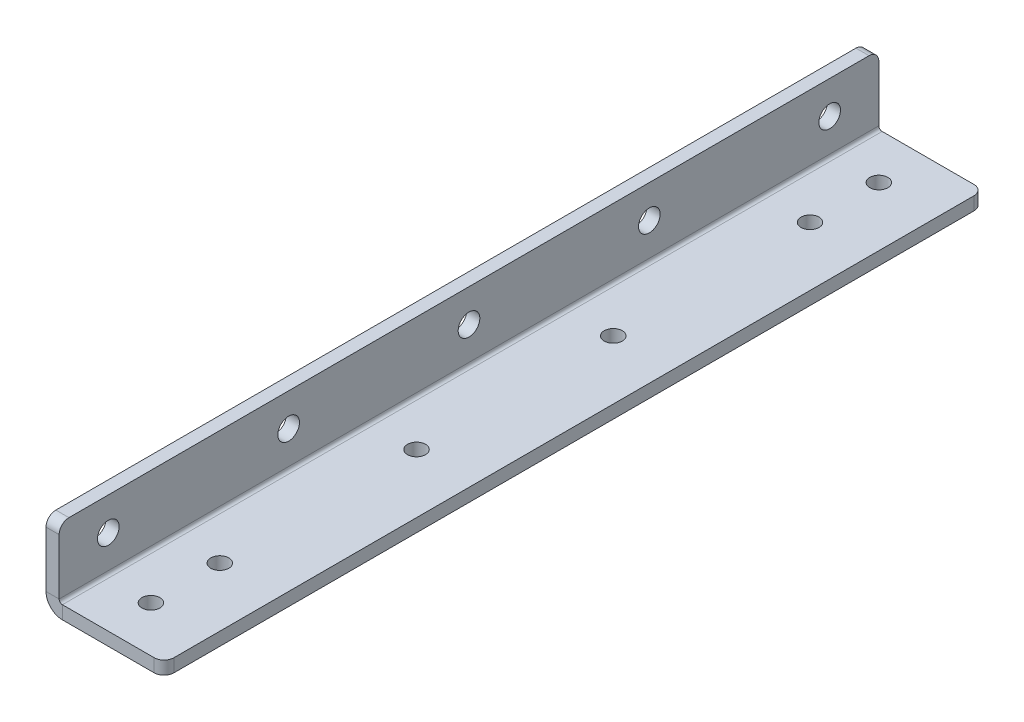
ISO-10303-21;
HEADER;
FILE_DESCRIPTION(('STEP AP214'),'2;1');
FILE_NAME('part.step','',(''),(''),'','','');
FILE_SCHEMA(('AUTOMOTIVE_DESIGN { 1 0 10303 214 1 1 1 1 }'));
ENDSEC;
DATA;
#1=APPLICATION_CONTEXT('core data for automotive mechanical design processes');
#2=APPLICATION_PROTOCOL_DEFINITION('international standard','automotive_design',2000,#1);
#3=PRODUCT_CONTEXT('',#1,'mechanical');
#4=PRODUCT('Part','Part','',(#3));
#5=PRODUCT_RELATED_PRODUCT_CATEGORY('part','',(#4));
#6=PRODUCT_DEFINITION_FORMATION('','',#4);
#7=PRODUCT_DEFINITION_CONTEXT('part definition',#1,'design');
#8=PRODUCT_DEFINITION('design','',#6,#7);
#9=PRODUCT_DEFINITION_SHAPE('','',#8);
#10=(LENGTH_UNIT() NAMED_UNIT(*) SI_UNIT(.MILLI.,.METRE.));
#11=(NAMED_UNIT(*) PLANE_ANGLE_UNIT() SI_UNIT($,.RADIAN.));
#12=(NAMED_UNIT(*) SI_UNIT($,.STERADIAN.) SOLID_ANGLE_UNIT());
#13=UNCERTAINTY_MEASURE_WITH_UNIT(LENGTH_MEASURE(1.E-05),#10,'distance_accuracy_value','');
#14=(GEOMETRIC_REPRESENTATION_CONTEXT(3) GLOBAL_UNCERTAINTY_ASSIGNED_CONTEXT((#13)) GLOBAL_UNIT_ASSIGNED_CONTEXT((#10,
#11,#12)) REPRESENTATION_CONTEXT('',''));
#15=CARTESIAN_POINT('',(0.,0.,0.));
#16=DIRECTION('',(0.,0.,1.));
#17=DIRECTION('',(1.,0.,0.));
#18=AXIS2_PLACEMENT_3D('',#15,#16,#17);
#19=CARTESIAN_POINT('',(0.,5.,125.));
#20=DIRECTION('',(0.,0.,1.));
#21=DIRECTION('',(1.,0.,0.));
#22=AXIS2_PLACEMENT_3D('',#19,#20,#21);
#23=PLANE('',#22);
#24=DIRECTION('',(1.,0.,0.));
#25=VECTOR('',#24,1.);
#26=CARTESIAN_POINT('',(0.,5.,125.));
#27=LINE('',#26,#25);
#28=CARTESIAN_POINT('',(0.,5.,125.));
#29=VERTEX_POINT('',#28);
#30=CARTESIAN_POINT('',(4.,5.,125.));
#31=VERTEX_POINT('',#30);
#32=EDGE_CURVE('E136',#29,#31,#27,.T.);
#33=ORIENTED_EDGE('',*,*,#32,.F.);
#34=CARTESIAN_POINT('',(5.,5.,125.));
#35=DIRECTION('',(0.,0.,-1.));
#36=DIRECTION('',(-1.,0.,0.));
#37=AXIS2_PLACEMENT_3D('',#34,#35,#36);
#38=CIRCLE('',#37,5.);
#39=CARTESIAN_POINT('',(5.,0.,125.));
#40=VERTEX_POINT('',#39);
#41=EDGE_CURVE('E134',#29,#40,#38,.F.);
#42=ORIENTED_EDGE('',*,*,#41,.T.);
#43=DIRECTION('',(0.,-1.,0.));
#44=VECTOR('',#43,1.);
#45=CARTESIAN_POINT('',(5.,4.,125.));
#46=LINE('',#45,#44);
#47=CARTESIAN_POINT('',(5.,4.,125.));
#48=VERTEX_POINT('',#47);
#49=EDGE_CURVE('E128',#48,#40,#46,.T.);
#50=ORIENTED_EDGE('',*,*,#49,.F.);
#51=CARTESIAN_POINT('',(5.,5.,125.));
#52=DIRECTION('',(0.,0.,1.));
#53=DIRECTION('',(1.,0.,0.));
#54=AXIS2_PLACEMENT_3D('',#51,#52,#53);
#55=CIRCLE('',#54,1.);
#56=EDGE_CURVE('E132',#31,#48,#55,.T.);
#57=ORIENTED_EDGE('',*,*,#56,.F.);
#58=EDGE_LOOP('',(#33,#42,#50,#57));
#59=FACE_BOUND('',#58,.T.);
#60=ADVANCED_FACE('F37',(#59),#23,.T.);
#61=CARTESIAN_POINT('',(5.,4.,125.));
#62=DIRECTION('',(0.,0.,1.));
#63=DIRECTION('',(1.,0.,0.));
#64=AXIS2_PLACEMENT_3D('',#61,#62,#63);
#65=PLANE('',#64);
#66=DIRECTION('',(0.,1.,0.));
#67=VECTOR('',#66,1.);
#68=CARTESIAN_POINT('',(4.,0.,125.));
#69=LINE('',#68,#67);
#70=CARTESIAN_POINT('',(4.,22.,125.));
#71=VERTEX_POINT('',#70);
#72=EDGE_CURVE('E160',#71,#31,#69,.F.);
#73=ORIENTED_EDGE('',*,*,#72,.F.);
#74=DIRECTION('',(1.,0.,0.));
#75=VECTOR('',#74,1.);
#76=CARTESIAN_POINT('',(5.,22.,125.));
#77=LINE('',#76,#75);
#78=CARTESIAN_POINT('',(0.,22.,125.));
#79=VERTEX_POINT('',#78);
#80=EDGE_CURVE('E11',#71,#79,#77,.F.);
#81=ORIENTED_EDGE('',*,*,#80,.T.);
#82=DIRECTION('',(0.,-1.,0.));
#83=VECTOR('',#82,1.);
#84=CARTESIAN_POINT('',(0.,0.,125.));
#85=LINE('',#84,#83);
#86=EDGE_CURVE('E162',#79,#29,#85,.T.);
#87=ORIENTED_EDGE('',*,*,#86,.T.);
#88=ORIENTED_EDGE('',*,*,#32,.T.);
#89=EDGE_LOOP('',(#73,#81,#87,#88));
#90=FACE_BOUND('',#89,.T.);
#91=ADVANCED_FACE('F359',(#90),#65,.T.);
#92=CARTESIAN_POINT('',(5.,0.,-125.));
#93=DIRECTION('',(0.,0.,-1.));
#94=DIRECTION('',(-1.,0.,0.));
#95=AXIS2_PLACEMENT_3D('',#92,#93,#94);
#96=PLANE('',#95);
#97=DIRECTION('',(0.,1.,0.));
#98=VECTOR('',#97,1.);
#99=CARTESIAN_POINT('',(5.,0.,-125.));
#100=LINE('',#99,#98);
#101=CARTESIAN_POINT('',(5.,0.,-125.));
#102=VERTEX_POINT('',#101);
#103=CARTESIAN_POINT('',(5.,4.,-125.));
#104=VERTEX_POINT('',#103);
#105=EDGE_CURVE('E137',#102,#104,#100,.T.);
#106=ORIENTED_EDGE('',*,*,#105,.F.);
#107=CARTESIAN_POINT('',(5.,5.,-125.));
#108=DIRECTION('',(0.,0.,-1.));
#109=DIRECTION('',(-1.,0.,0.));
#110=AXIS2_PLACEMENT_3D('',#107,#108,#109);
#111=CIRCLE('',#110,5.);
#112=CARTESIAN_POINT('',(0.,5.,-125.));
#113=VERTEX_POINT('',#112);
#114=EDGE_CURVE('E180',#113,#102,#111,.F.);
#115=ORIENTED_EDGE('',*,*,#114,.F.);
#116=DIRECTION('',(-1.,0.,0.));
#117=VECTOR('',#116,1.);
#118=CARTESIAN_POINT('',(4.,5.,-125.));
#119=LINE('',#118,#117);
#120=CARTESIAN_POINT('',(4.,5.,-125.));
#121=VERTEX_POINT('',#120);
#122=EDGE_CURVE('E198',#121,#113,#119,.T.);
#123=ORIENTED_EDGE('',*,*,#122,.F.);
#124=CARTESIAN_POINT('',(5.,5.,-125.));
#125=DIRECTION('',(0.,0.,1.));
#126=DIRECTION('',(1.,0.,0.));
#127=AXIS2_PLACEMENT_3D('',#124,#125,#126);
#128=CIRCLE('',#127,1.);
#129=EDGE_CURVE('E174',#121,#104,#128,.T.);
#130=ORIENTED_EDGE('',*,*,#129,.T.);
#131=EDGE_LOOP('',(#106,#115,#123,#130));
#132=FACE_BOUND('',#131,.T.);
#133=ADVANCED_FACE('F340',(#132),#96,.T.);
#134=CARTESIAN_POINT('',(4.,5.,-125.));
#135=DIRECTION('',(0.,0.,-1.));
#136=DIRECTION('',(-1.,0.,0.));
#137=AXIS2_PLACEMENT_3D('',#134,#135,#136);
#138=PLANE('',#137);
#139=DIRECTION('',(1.,0.,0.));
#140=VECTOR('',#139,1.);
#141=CARTESIAN_POINT('',(0.,4.,-125.));
#142=LINE('',#141,#140);
#143=CARTESIAN_POINT('',(33.,4.,-125.));
#144=VERTEX_POINT('',#143);
#145=EDGE_CURVE('E147',#104,#144,#142,.T.);
#146=ORIENTED_EDGE('',*,*,#145,.T.);
#147=DIRECTION('',(0.,-1.,0.));
#148=VECTOR('',#147,1.);
#149=CARTESIAN_POINT('',(33.,5.,-125.));
#150=LINE('',#149,#148);
#151=CARTESIAN_POINT('',(33.,0.,-125.));
#152=VERTEX_POINT('',#151);
#153=EDGE_CURVE('E220',#144,#152,#150,.T.);
#154=ORIENTED_EDGE('',*,*,#153,.T.);
#155=DIRECTION('',(1.,0.,0.));
#156=VECTOR('',#155,1.);
#157=CARTESIAN_POINT('',(0.,0.,-125.));
#158=LINE('',#157,#156);
#159=EDGE_CURVE('E169',#102,#152,#158,.T.);
#160=ORIENTED_EDGE('',*,*,#159,.F.);
#161=ORIENTED_EDGE('',*,*,#105,.T.);
#162=EDGE_LOOP('',(#146,#154,#160,#161));
#163=FACE_BOUND('',#162,.T.);
#164=ADVANCED_FACE('F238',(#163),#138,.T.);
#165=CARTESIAN_POINT('',(0.,0.,125.));
#166=DIRECTION('',(0.,1.,0.));
#167=DIRECTION('',(0.,0.,1.));
#168=AXIS2_PLACEMENT_3D('',#165,#166,#167);
#169=PLANE('',#168);
#170=CARTESIAN_POINT('',(18.,0.,111.));
#171=DIRECTION('',(0.,1.,0.));
#172=DIRECTION('',(0.,0.,1.));
#173=AXIS2_PLACEMENT_3D('',#170,#171,#172);
#174=CIRCLE('',#173,2.74999999999999);
#175=CARTESIAN_POINT('',(18.,0.,113.75));
#176=VERTEX_POINT('',#175);
#177=EDGE_CURVE('E279',#176,#176,#174,.T.);
#178=ORIENTED_EDGE('',*,*,#177,.T.);
#179=EDGE_LOOP('',(#178));
#180=FACE_BOUND('',#179,.T.);
#181=CARTESIAN_POINT('',(18.,0.,-111.));
#182=DIRECTION('',(0.,1.,0.));
#183=DIRECTION('',(0.,0.,1.));
#184=AXIS2_PLACEMENT_3D('',#181,#182,#183);
#185=CIRCLE('',#184,2.74999999999999);
#186=CARTESIAN_POINT('',(18.,0.,-108.25));
#187=VERTEX_POINT('',#186);
#188=EDGE_CURVE('E273',#187,#187,#185,.T.);
#189=ORIENTED_EDGE('',*,*,#188,.T.);
#190=EDGE_LOOP('',(#189));
#191=FACE_BOUND('',#190,.T.);
#192=CARTESIAN_POINT('',(18.,0.,-90.));
#193=DIRECTION('',(0.,1.,0.));
#194=DIRECTION('',(0.,0.,1.));
#195=AXIS2_PLACEMENT_3D('',#192,#193,#194);
#196=CIRCLE('',#195,2.75);
#197=CARTESIAN_POINT('',(18.,0.,-87.25));
#198=VERTEX_POINT('',#197);
#199=EDGE_CURVE('E267',#198,#198,#196,.T.);
#200=ORIENTED_EDGE('',*,*,#199,.T.);
#201=EDGE_LOOP('',(#200));
#202=FACE_BOUND('',#201,.T.);
#203=CARTESIAN_POINT('',(18.0000000000006,0.,-30.));
#204=DIRECTION('',(0.,1.,0.));
#205=DIRECTION('',(0.,0.,1.));
#206=AXIS2_PLACEMENT_3D('',#203,#204,#205);
#207=CIRCLE('',#206,2.75);
#208=CARTESIAN_POINT('',(18.0000000000006,0.,-27.25));
#209=VERTEX_POINT('',#208);
#210=EDGE_CURVE('E261',#209,#209,#207,.T.);
#211=ORIENTED_EDGE('',*,*,#210,.T.);
#212=EDGE_LOOP('',(#211));
#213=FACE_BOUND('',#212,.T.);
#214=CARTESIAN_POINT('',(18.0000000000012,0.,30.));
#215=DIRECTION('',(0.,1.,0.));
#216=DIRECTION('',(0.,0.,1.));
#217=AXIS2_PLACEMENT_3D('',#214,#215,#216);
#218=CIRCLE('',#217,2.75);
#219=CARTESIAN_POINT('',(18.0000000000012,0.,32.75));
#220=VERTEX_POINT('',#219);
#221=EDGE_CURVE('E255',#220,#220,#218,.T.);
#222=ORIENTED_EDGE('',*,*,#221,.T.);
#223=EDGE_LOOP('',(#222));
#224=FACE_BOUND('',#223,.T.);
#225=CARTESIAN_POINT('',(18.0000000000019,0.,90.));
#226=DIRECTION('',(0.,1.,0.));
#227=DIRECTION('',(0.,0.,1.));
#228=AXIS2_PLACEMENT_3D('',#225,#226,#227);
#229=CIRCLE('',#228,2.75);
#230=CARTESIAN_POINT('',(18.0000000000019,0.,92.75));
#231=VERTEX_POINT('',#230);
#232=EDGE_CURVE('E172',#231,#231,#229,.T.);
#233=ORIENTED_EDGE('',*,*,#232,.T.);
#234=EDGE_LOOP('',(#233));
#235=FACE_BOUND('',#234,.T.);
#236=ORIENTED_EDGE('',*,*,#159,.T.);
#237=CARTESIAN_POINT('',(33.,0.,-122.));
#238=DIRECTION('',(0.,1.,0.));
#239=DIRECTION('',(0.,0.,1.));
#240=AXIS2_PLACEMENT_3D('',#237,#238,#239);
#241=CIRCLE('',#240,3.);
#242=CARTESIAN_POINT('',(36.,0.,-122.));
#243=VERTEX_POINT('',#242);
#244=EDGE_CURVE('E225',#152,#243,#241,.F.);
#245=ORIENTED_EDGE('',*,*,#244,.T.);
#246=DIRECTION('',(0.,0.,-1.));
#247=VECTOR('',#246,1.);
#248=CARTESIAN_POINT('',(36.,0.,125.));
#249=LINE('',#248,#247);
#250=CARTESIAN_POINT('',(36.,0.,122.));
#251=VERTEX_POINT('',#250);
#252=EDGE_CURVE('E196',#251,#243,#249,.T.);
#253=ORIENTED_EDGE('',*,*,#252,.F.);
#254=CARTESIAN_POINT('',(33.,0.,122.));
#255=DIRECTION('',(0.,1.,0.));
#256=DIRECTION('',(0.,0.,1.));
#257=AXIS2_PLACEMENT_3D('',#254,#255,#256);
#258=CIRCLE('',#257,3.);
#259=CARTESIAN_POINT('',(33.,0.,125.));
#260=VERTEX_POINT('',#259);
#261=EDGE_CURVE('E223',#251,#260,#258,.F.);
#262=ORIENTED_EDGE('',*,*,#261,.T.);
#263=DIRECTION('',(1.,0.,0.));
#264=VECTOR('',#263,1.);
#265=CARTESIAN_POINT('',(0.,0.,125.));
#266=LINE('',#265,#264);
#267=EDGE_CURVE('E155',#40,#260,#266,.T.);
#268=ORIENTED_EDGE('',*,*,#267,.F.);
#269=DIRECTION('',(0.,0.,-1.));
#270=VECTOR('',#269,1.);
#271=CARTESIAN_POINT('',(5.,0.,125.));
#272=LINE('',#271,#270);
#273=EDGE_CURVE('E168',#40,#102,#272,.T.);
#274=ORIENTED_EDGE('',*,*,#273,.T.);
#275=EDGE_LOOP('',(#236,#245,#253,#262,#268,#274));
#276=FACE_BOUND('',#275,.T.);
#277=ADVANCED_FACE('F243',(#180,#191,#202,#213,#224,#235,#276),#169,.F.);
#278=CARTESIAN_POINT('',(36.,4.,125.));
#279=DIRECTION('',(1.,0.,0.));
#280=DIRECTION('',(0.,0.,-1.));
#281=AXIS2_PLACEMENT_3D('',#278,#279,#280);
#282=PLANE('',#281);
#283=ORIENTED_EDGE('',*,*,#252,.T.);
#284=DIRECTION('',(0.,-1.,0.));
#285=VECTOR('',#284,1.);
#286=CARTESIAN_POINT('',(36.,4.,-122.));
#287=LINE('',#286,#285);
#288=CARTESIAN_POINT('',(36.,4.,-122.));
#289=VERTEX_POINT('',#288);
#290=EDGE_CURVE('E59',#243,#289,#287,.F.);
#291=ORIENTED_EDGE('',*,*,#290,.T.);
#292=DIRECTION('',(0.,0.,-1.));
#293=VECTOR('',#292,1.);
#294=CARTESIAN_POINT('',(36.,4.,125.));
#295=LINE('',#294,#293);
#296=CARTESIAN_POINT('',(36.,4.,122.));
#297=VERTEX_POINT('',#296);
#298=EDGE_CURVE('E151',#297,#289,#295,.T.);
#299=ORIENTED_EDGE('',*,*,#298,.F.);
#300=DIRECTION('',(0.,-1.,0.));
#301=VECTOR('',#300,1.);
#302=CARTESIAN_POINT('',(36.,4.,122.));
#303=LINE('',#302,#301);
#304=EDGE_CURVE('E227',#297,#251,#303,.T.);
#305=ORIENTED_EDGE('',*,*,#304,.T.);
#306=EDGE_LOOP('',(#283,#291,#299,#305));
#307=FACE_BOUND('',#306,.T.);
#308=ADVANCED_FACE('F244',(#307),#282,.T.);
#309=CARTESIAN_POINT('',(0.,4.,125.));
#310=DIRECTION('',(0.,1.,0.));
#311=DIRECTION('',(0.,0.,1.));
#312=AXIS2_PLACEMENT_3D('',#309,#310,#311);
#313=PLANE('',#312);
#314=CARTESIAN_POINT('',(18.,4.,111.));
#315=DIRECTION('',(0.,1.,0.));
#316=DIRECTION('',(0.,0.,1.));
#317=AXIS2_PLACEMENT_3D('',#314,#315,#316);
#318=CIRCLE('',#317,2.74999999999999);
#319=CARTESIAN_POINT('',(18.,4.,113.75));
#320=VERTEX_POINT('',#319);
#321=EDGE_CURVE('E282',#320,#320,#318,.T.);
#322=ORIENTED_EDGE('',*,*,#321,.F.);
#323=EDGE_LOOP('',(#322));
#324=FACE_BOUND('',#323,.T.);
#325=CARTESIAN_POINT('',(18.,4.,-111.));
#326=DIRECTION('',(0.,1.,0.));
#327=DIRECTION('',(0.,0.,1.));
#328=AXIS2_PLACEMENT_3D('',#325,#326,#327);
#329=CIRCLE('',#328,2.74999999999999);
#330=CARTESIAN_POINT('',(18.,4.,-108.25));
#331=VERTEX_POINT('',#330);
#332=EDGE_CURVE('E276',#331,#331,#329,.T.);
#333=ORIENTED_EDGE('',*,*,#332,.F.);
#334=EDGE_LOOP('',(#333));
#335=FACE_BOUND('',#334,.T.);
#336=CARTESIAN_POINT('',(18.,4.,-90.));
#337=DIRECTION('',(0.,1.,0.));
#338=DIRECTION('',(0.,0.,1.));
#339=AXIS2_PLACEMENT_3D('',#336,#337,#338);
#340=CIRCLE('',#339,2.75);
#341=CARTESIAN_POINT('',(18.,4.,-87.25));
#342=VERTEX_POINT('',#341);
#343=EDGE_CURVE('E270',#342,#342,#340,.T.);
#344=ORIENTED_EDGE('',*,*,#343,.F.);
#345=EDGE_LOOP('',(#344));
#346=FACE_BOUND('',#345,.T.);
#347=CARTESIAN_POINT('',(18.0000000000006,4.,-30.));
#348=DIRECTION('',(0.,1.,0.));
#349=DIRECTION('',(0.,0.,1.));
#350=AXIS2_PLACEMENT_3D('',#347,#348,#349);
#351=CIRCLE('',#350,2.75);
#352=CARTESIAN_POINT('',(18.0000000000006,4.,-27.25));
#353=VERTEX_POINT('',#352);
#354=EDGE_CURVE('E264',#353,#353,#351,.T.);
#355=ORIENTED_EDGE('',*,*,#354,.F.);
#356=EDGE_LOOP('',(#355));
#357=FACE_BOUND('',#356,.T.);
#358=CARTESIAN_POINT('',(18.0000000000012,4.,30.));
#359=DIRECTION('',(0.,1.,0.));
#360=DIRECTION('',(0.,0.,1.));
#361=AXIS2_PLACEMENT_3D('',#358,#359,#360);
#362=CIRCLE('',#361,2.75);
#363=CARTESIAN_POINT('',(18.0000000000012,4.,32.75));
#364=VERTEX_POINT('',#363);
#365=EDGE_CURVE('E258',#364,#364,#362,.T.);
#366=ORIENTED_EDGE('',*,*,#365,.F.);
#367=EDGE_LOOP('',(#366));
#368=FACE_BOUND('',#367,.T.);
#369=CARTESIAN_POINT('',(18.0000000000019,4.,90.));
#370=DIRECTION('',(0.,1.,0.));
#371=DIRECTION('',(0.,0.,1.));
#372=AXIS2_PLACEMENT_3D('',#369,#370,#371);
#373=CIRCLE('',#372,2.75);
#374=CARTESIAN_POINT('',(18.0000000000019,4.,92.75));
#375=VERTEX_POINT('',#374);
#376=EDGE_CURVE('E252',#375,#375,#373,.T.);
#377=ORIENTED_EDGE('',*,*,#376,.F.);
#378=EDGE_LOOP('',(#377));
#379=FACE_BOUND('',#378,.T.);
#380=ORIENTED_EDGE('',*,*,#298,.T.);
#381=CARTESIAN_POINT('',(33.,4.,-122.));
#382=DIRECTION('',(0.,1.,0.));
#383=DIRECTION('',(0.,0.,1.));
#384=AXIS2_PLACEMENT_3D('',#381,#382,#383);
#385=CIRCLE('',#384,3.);
#386=EDGE_CURVE('E233',#289,#144,#385,.T.);
#387=ORIENTED_EDGE('',*,*,#386,.T.);
#388=ORIENTED_EDGE('',*,*,#145,.F.);
#389=DIRECTION('',(0.,0.,-1.));
#390=VECTOR('',#389,1.);
#391=CARTESIAN_POINT('',(5.,4.,125.));
#392=LINE('',#391,#390);
#393=EDGE_CURVE('E142',#48,#104,#392,.T.);
#394=ORIENTED_EDGE('',*,*,#393,.F.);
#395=DIRECTION('',(1.,0.,0.));
#396=VECTOR('',#395,1.);
#397=CARTESIAN_POINT('',(0.,4.,125.));
#398=LINE('',#397,#396);
#399=CARTESIAN_POINT('',(33.,4.,125.));
#400=VERTEX_POINT('',#399);
#401=EDGE_CURVE('E144',#48,#400,#398,.T.);
#402=ORIENTED_EDGE('',*,*,#401,.T.);
#403=CARTESIAN_POINT('',(33.,4.,122.));
#404=DIRECTION('',(0.,1.,0.));
#405=DIRECTION('',(0.,0.,1.));
#406=AXIS2_PLACEMENT_3D('',#403,#404,#405);
#407=CIRCLE('',#406,3.);
#408=EDGE_CURVE('E231',#400,#297,#407,.T.);
#409=ORIENTED_EDGE('',*,*,#408,.T.);
#410=EDGE_LOOP('',(#380,#387,#388,#394,#402,#409));
#411=FACE_BOUND('',#410,.T.);
#412=ADVANCED_FACE('F143',(#324,#335,#346,#357,#368,#379,#411),#313,.T.);
#413=CARTESIAN_POINT('',(5.,5.,125.));
#414=DIRECTION('',(0.,0.,-1.));
#415=DIRECTION('',(-1.,0.,0.));
#416=AXIS2_PLACEMENT_3D('',#413,#414,#415);
#417=CYLINDRICAL_SURFACE('',#416,1.);
#418=ORIENTED_EDGE('',*,*,#129,.F.);
#419=DIRECTION('',(0.,0.,-1.));
#420=VECTOR('',#419,1.);
#421=CARTESIAN_POINT('',(4.,5.,125.));
#422=LINE('',#421,#420);
#423=EDGE_CURVE('E152',#31,#121,#422,.T.);
#424=ORIENTED_EDGE('',*,*,#423,.F.);
#425=ORIENTED_EDGE('',*,*,#56,.T.);
#426=ORIENTED_EDGE('',*,*,#393,.T.);
#427=EDGE_LOOP('',(#418,#424,#425,#426));
#428=FACE_BOUND('',#427,.T.);
#429=ADVANCED_FACE('F158',(#428),#417,.F.);
#430=CARTESIAN_POINT('',(4.,0.,125.));
#431=DIRECTION('',(1.,0.,0.));
#432=DIRECTION('',(0.,0.,-1.));
#433=AXIS2_PLACEMENT_3D('',#430,#431,#432);
#434=PLANE('',#433);
#435=CARTESIAN_POINT('',(4.,15.,110.));
#436=DIRECTION('',(1.,0.,0.));
#437=DIRECTION('',(0.,0.,-1.));
#438=AXIS2_PLACEMENT_3D('',#435,#436,#437);
#439=CIRCLE('',#438,3.29999999999999);
#440=CARTESIAN_POINT('',(4.,15.,106.7));
#441=VERTEX_POINT('',#440);
#442=EDGE_CURVE('E312',#441,#441,#439,.T.);
#443=ORIENTED_EDGE('',*,*,#442,.F.);
#444=EDGE_LOOP('',(#443));
#445=FACE_BOUND('',#444,.T.);
#446=CARTESIAN_POINT('',(4.,15.,55.));
#447=DIRECTION('',(1.,0.,0.));
#448=DIRECTION('',(0.,0.,-1.));
#449=AXIS2_PLACEMENT_3D('',#446,#447,#448);
#450=CIRCLE('',#449,3.29999999999999);
#451=CARTESIAN_POINT('',(4.,15.,51.7));
#452=VERTEX_POINT('',#451);
#453=EDGE_CURVE('E306',#452,#452,#450,.T.);
#454=ORIENTED_EDGE('',*,*,#453,.F.);
#455=EDGE_LOOP('',(#454));
#456=FACE_BOUND('',#455,.T.);
#457=CARTESIAN_POINT('',(4.,15.,0.));
#458=DIRECTION('',(1.,0.,0.));
#459=DIRECTION('',(0.,0.,-1.));
#460=AXIS2_PLACEMENT_3D('',#457,#458,#459);
#461=CIRCLE('',#460,3.29999999999999);
#462=CARTESIAN_POINT('',(4.,15.,-3.29999999999999));
#463=VERTEX_POINT('',#462);
#464=EDGE_CURVE('E300',#463,#463,#461,.T.);
#465=ORIENTED_EDGE('',*,*,#464,.F.);
#466=EDGE_LOOP('',(#465));
#467=FACE_BOUND('',#466,.T.);
#468=CARTESIAN_POINT('',(4.,15.,-55.));
#469=DIRECTION('',(1.,0.,0.));
#470=DIRECTION('',(0.,0.,-1.));
#471=AXIS2_PLACEMENT_3D('',#468,#469,#470);
#472=CIRCLE('',#471,3.29999999999999);
#473=CARTESIAN_POINT('',(4.,15.,-58.3));
#474=VERTEX_POINT('',#473);
#475=EDGE_CURVE('E294',#474,#474,#472,.T.);
#476=ORIENTED_EDGE('',*,*,#475,.F.);
#477=EDGE_LOOP('',(#476));
#478=FACE_BOUND('',#477,.T.);
#479=CARTESIAN_POINT('',(4.,15.,-110.));
#480=DIRECTION('',(1.,0.,0.));
#481=DIRECTION('',(0.,0.,-1.));
#482=AXIS2_PLACEMENT_3D('',#479,#480,#481);
#483=CIRCLE('',#482,3.29999999999999);
#484=CARTESIAN_POINT('',(4.,15.,-113.3));
#485=VERTEX_POINT('',#484);
#486=EDGE_CURVE('E288',#485,#485,#483,.T.);
#487=ORIENTED_EDGE('',*,*,#486,.F.);
#488=EDGE_LOOP('',(#487));
#489=FACE_BOUND('',#488,.T.);
#490=DIRECTION('',(0.,1.,0.));
#491=VECTOR('',#490,1.);
#492=CARTESIAN_POINT('',(4.,0.,-125.));
#493=LINE('',#492,#491);
#494=CARTESIAN_POINT('',(4.,22.,-125.));
#495=VERTEX_POINT('',#494);
#496=EDGE_CURVE('E176',#495,#121,#493,.F.);
#497=ORIENTED_EDGE('',*,*,#496,.F.);
#498=CARTESIAN_POINT('',(4.,22.,-122.));
#499=DIRECTION('',(1.,0.,0.));
#500=DIRECTION('',(0.,0.,-1.));
#501=AXIS2_PLACEMENT_3D('',#498,#499,#500);
#502=CIRCLE('',#501,3.);
#503=CARTESIAN_POINT('',(4.,25.,-122.));
#504=VERTEX_POINT('',#503);
#505=EDGE_CURVE('E209',#495,#504,#502,.T.);
#506=ORIENTED_EDGE('',*,*,#505,.T.);
#507=DIRECTION('',(0.,0.,-1.));
#508=VECTOR('',#507,1.);
#509=CARTESIAN_POINT('',(4.,25.,125.));
#510=LINE('',#509,#508);
#511=CARTESIAN_POINT('',(4.,25.,122.));
#512=VERTEX_POINT('',#511);
#513=EDGE_CURVE('E191',#512,#504,#510,.T.);
#514=ORIENTED_EDGE('',*,*,#513,.F.);
#515=CARTESIAN_POINT('',(4.,22.,122.));
#516=DIRECTION('',(1.,0.,0.));
#517=DIRECTION('',(0.,0.,-1.));
#518=AXIS2_PLACEMENT_3D('',#515,#516,#517);
#519=CIRCLE('',#518,3.);
#520=EDGE_CURVE('E207',#512,#71,#519,.T.);
#521=ORIENTED_EDGE('',*,*,#520,.T.);
#522=ORIENTED_EDGE('',*,*,#72,.T.);
#523=ORIENTED_EDGE('',*,*,#423,.T.);
#524=EDGE_LOOP('',(#497,#506,#514,#521,#522,#523));
#525=FACE_BOUND('',#524,.T.);
#526=ADVANCED_FACE('F318',(#445,#456,#467,#478,#489,#525),#434,.T.);
#527=CARTESIAN_POINT('',(0.,25.,125.));
#528=DIRECTION('',(0.,1.,0.));
#529=DIRECTION('',(0.,0.,1.));
#530=AXIS2_PLACEMENT_3D('',#527,#528,#529);
#531=PLANE('',#530);
#532=ORIENTED_EDGE('',*,*,#513,.T.);
#533=DIRECTION('',(1.,0.,0.));
#534=VECTOR('',#533,1.);
#535=CARTESIAN_POINT('',(0.,25.,-122.));
#536=LINE('',#535,#534);
#537=CARTESIAN_POINT('',(0.,25.,-122.));
#538=VERTEX_POINT('',#537);
#539=EDGE_CURVE('E214',#504,#538,#536,.F.);
#540=ORIENTED_EDGE('',*,*,#539,.T.);
#541=DIRECTION('',(0.,0.,-1.));
#542=VECTOR('',#541,1.);
#543=CARTESIAN_POINT('',(0.,25.,125.));
#544=LINE('',#543,#542);
#545=CARTESIAN_POINT('',(0.,25.,122.));
#546=VERTEX_POINT('',#545);
#547=EDGE_CURVE('E188',#546,#538,#544,.T.);
#548=ORIENTED_EDGE('',*,*,#547,.F.);
#549=DIRECTION('',(1.,0.,0.));
#550=VECTOR('',#549,1.);
#551=CARTESIAN_POINT('',(0.,25.,122.));
#552=LINE('',#551,#550);
#553=EDGE_CURVE('E211',#546,#512,#552,.T.);
#554=ORIENTED_EDGE('',*,*,#553,.T.);
#555=EDGE_LOOP('',(#532,#540,#548,#554));
#556=FACE_BOUND('',#555,.T.);
#557=ADVANCED_FACE('F321',(#556),#531,.T.);
#558=CARTESIAN_POINT('',(0.,0.,125.));
#559=DIRECTION('',(1.,0.,0.));
#560=DIRECTION('',(0.,0.,-1.));
#561=AXIS2_PLACEMENT_3D('',#558,#559,#560);
#562=PLANE('',#561);
#563=CARTESIAN_POINT('',(0.,15.,110.));
#564=DIRECTION('',(1.,0.,0.));
#565=DIRECTION('',(0.,0.,-1.));
#566=AXIS2_PLACEMENT_3D('',#563,#564,#565);
#567=CIRCLE('',#566,3.29999999999999);
#568=CARTESIAN_POINT('',(0.,15.,106.7));
#569=VERTEX_POINT('',#568);
#570=EDGE_CURVE('E309',#569,#569,#567,.T.);
#571=ORIENTED_EDGE('',*,*,#570,.T.);
#572=EDGE_LOOP('',(#571));
#573=FACE_BOUND('',#572,.T.);
#574=CARTESIAN_POINT('',(0.,15.,55.));
#575=DIRECTION('',(1.,0.,0.));
#576=DIRECTION('',(0.,0.,-1.));
#577=AXIS2_PLACEMENT_3D('',#574,#575,#576);
#578=CIRCLE('',#577,3.29999999999999);
#579=CARTESIAN_POINT('',(0.,15.,51.7));
#580=VERTEX_POINT('',#579);
#581=EDGE_CURVE('E303',#580,#580,#578,.T.);
#582=ORIENTED_EDGE('',*,*,#581,.T.);
#583=EDGE_LOOP('',(#582));
#584=FACE_BOUND('',#583,.T.);
#585=CARTESIAN_POINT('',(0.,15.,0.));
#586=DIRECTION('',(1.,0.,0.));
#587=DIRECTION('',(0.,0.,-1.));
#588=AXIS2_PLACEMENT_3D('',#585,#586,#587);
#589=CIRCLE('',#588,3.29999999999999);
#590=CARTESIAN_POINT('',(0.,15.,-3.29999999999999));
#591=VERTEX_POINT('',#590);
#592=EDGE_CURVE('E297',#591,#591,#589,.T.);
#593=ORIENTED_EDGE('',*,*,#592,.T.);
#594=EDGE_LOOP('',(#593));
#595=FACE_BOUND('',#594,.T.);
#596=CARTESIAN_POINT('',(0.,15.,-55.));
#597=DIRECTION('',(1.,0.,0.));
#598=DIRECTION('',(0.,0.,-1.));
#599=AXIS2_PLACEMENT_3D('',#596,#597,#598);
#600=CIRCLE('',#599,3.29999999999999);
#601=CARTESIAN_POINT('',(0.,15.,-58.3));
#602=VERTEX_POINT('',#601);
#603=EDGE_CURVE('E291',#602,#602,#600,.T.);
#604=ORIENTED_EDGE('',*,*,#603,.T.);
#605=EDGE_LOOP('',(#604));
#606=FACE_BOUND('',#605,.T.);
#607=CARTESIAN_POINT('',(0.,15.,-110.));
#608=DIRECTION('',(1.,0.,0.));
#609=DIRECTION('',(0.,0.,-1.));
#610=AXIS2_PLACEMENT_3D('',#607,#608,#609);
#611=CIRCLE('',#610,3.29999999999999);
#612=CARTESIAN_POINT('',(0.,15.,-113.3));
#613=VERTEX_POINT('',#612);
#614=EDGE_CURVE('E285',#613,#613,#611,.T.);
#615=ORIENTED_EDGE('',*,*,#614,.T.);
#616=EDGE_LOOP('',(#615));
#617=FACE_BOUND('',#616,.T.);
#618=ORIENTED_EDGE('',*,*,#547,.T.);
#619=CARTESIAN_POINT('',(0.,22.,-122.));
#620=DIRECTION('',(1.,0.,0.));
#621=DIRECTION('',(0.,0.,-1.));
#622=AXIS2_PLACEMENT_3D('',#619,#620,#621);
#623=CIRCLE('',#622,3.);
#624=CARTESIAN_POINT('',(0.,22.,-125.));
#625=VERTEX_POINT('',#624);
#626=EDGE_CURVE('E218',#538,#625,#623,.F.);
#627=ORIENTED_EDGE('',*,*,#626,.T.);
#628=DIRECTION('',(0.,-1.,0.));
#629=VECTOR('',#628,1.);
#630=CARTESIAN_POINT('',(0.,0.,-125.));
#631=LINE('',#630,#629);
#632=EDGE_CURVE('E178',#625,#113,#631,.T.);
#633=ORIENTED_EDGE('',*,*,#632,.T.);
#634=DIRECTION('',(0.,0.,-1.));
#635=VECTOR('',#634,1.);
#636=CARTESIAN_POINT('',(0.,5.,125.));
#637=LINE('',#636,#635);
#638=EDGE_CURVE('E185',#29,#113,#637,.T.);
#639=ORIENTED_EDGE('',*,*,#638,.F.);
#640=ORIENTED_EDGE('',*,*,#86,.F.);
#641=CARTESIAN_POINT('',(0.,22.,122.));
#642=DIRECTION('',(1.,0.,0.));
#643=DIRECTION('',(0.,0.,-1.));
#644=AXIS2_PLACEMENT_3D('',#641,#642,#643);
#645=CIRCLE('',#644,3.);
#646=EDGE_CURVE('E216',#79,#546,#645,.F.);
#647=ORIENTED_EDGE('',*,*,#646,.T.);
#648=EDGE_LOOP('',(#618,#627,#633,#639,#640,#647));
#649=FACE_BOUND('',#648,.T.);
#650=ADVANCED_FACE('F346',(#573,#584,#595,#606,#617,#649),#562,.F.);
#651=CARTESIAN_POINT('',(5.,5.,125.));
#652=DIRECTION('',(0.,0.,-1.));
#653=DIRECTION('',(-1.,0.,0.));
#654=AXIS2_PLACEMENT_3D('',#651,#652,#653);
#655=CYLINDRICAL_SURFACE('',#654,5.);
#656=ORIENTED_EDGE('',*,*,#114,.T.);
#657=ORIENTED_EDGE('',*,*,#273,.F.);
#658=ORIENTED_EDGE('',*,*,#41,.F.);
#659=ORIENTED_EDGE('',*,*,#638,.T.);
#660=EDGE_LOOP('',(#656,#657,#658,#659));
#661=FACE_BOUND('',#660,.T.);
#662=ADVANCED_FACE('F342',(#661),#655,.T.);
#663=CARTESIAN_POINT('',(5.,5.,125.));
#664=DIRECTION('',(0.,0.,1.));
#665=DIRECTION('',(1.,0.,0.));
#666=AXIS2_PLACEMENT_3D('',#663,#664,#665);
#667=PLANE('',#666);
#668=ORIENTED_EDGE('',*,*,#267,.T.);
#669=DIRECTION('',(0.,-1.,0.));
#670=VECTOR('',#669,1.);
#671=CARTESIAN_POINT('',(33.,5.,125.));
#672=LINE('',#671,#670);
#673=EDGE_CURVE('E45',#260,#400,#672,.F.);
#674=ORIENTED_EDGE('',*,*,#673,.T.);
#675=ORIENTED_EDGE('',*,*,#401,.F.);
#676=ORIENTED_EDGE('',*,*,#49,.T.);
#677=EDGE_LOOP('',(#668,#674,#675,#676));
#678=FACE_BOUND('',#677,.T.);
#679=ADVANCED_FACE('F154',(#678),#667,.T.);
#680=CARTESIAN_POINT('',(5.,5.,-125.));
#681=DIRECTION('',(0.,0.,1.));
#682=DIRECTION('',(1.,0.,0.));
#683=AXIS2_PLACEMENT_3D('',#680,#681,#682);
#684=PLANE('',#683);
#685=ORIENTED_EDGE('',*,*,#632,.F.);
#686=DIRECTION('',(1.,0.,0.));
#687=VECTOR('',#686,1.);
#688=CARTESIAN_POINT('',(4.,22.,-125.));
#689=LINE('',#688,#687);
#690=EDGE_CURVE('E204',#625,#495,#689,.T.);
#691=ORIENTED_EDGE('',*,*,#690,.T.);
#692=ORIENTED_EDGE('',*,*,#496,.T.);
#693=ORIENTED_EDGE('',*,*,#122,.T.);
#694=EDGE_LOOP('',(#685,#691,#692,#693));
#695=FACE_BOUND('',#694,.T.);
#696=ADVANCED_FACE('F336',(#695),#684,.F.);
#697=CARTESIAN_POINT('',(5.,22.,-122.));
#698=DIRECTION('',(-1.,0.,0.));
#699=DIRECTION('',(0.,0.,1.));
#700=AXIS2_PLACEMENT_3D('',#697,#698,#699);
#701=CYLINDRICAL_SURFACE('',#700,3.);
#702=ORIENTED_EDGE('',*,*,#626,.F.);
#703=ORIENTED_EDGE('',*,*,#539,.F.);
#704=ORIENTED_EDGE('',*,*,#505,.F.);
#705=ORIENTED_EDGE('',*,*,#690,.F.);
#706=EDGE_LOOP('',(#702,#703,#704,#705));
#707=FACE_BOUND('',#706,.T.);
#708=ADVANCED_FACE('F350',(#707),#701,.T.);
#709=CARTESIAN_POINT('',(33.,5.,-122.));
#710=DIRECTION('',(0.,-1.,0.));
#711=DIRECTION('',(0.,0.,-1.));
#712=AXIS2_PLACEMENT_3D('',#709,#710,#711);
#713=CYLINDRICAL_SURFACE('',#712,3.);
#714=ORIENTED_EDGE('',*,*,#386,.F.);
#715=ORIENTED_EDGE('',*,*,#290,.F.);
#716=ORIENTED_EDGE('',*,*,#244,.F.);
#717=ORIENTED_EDGE('',*,*,#153,.F.);
#718=EDGE_LOOP('',(#714,#715,#716,#717));
#719=FACE_BOUND('',#718,.T.);
#720=ADVANCED_FACE('F240',(#719),#713,.T.);
#721=CARTESIAN_POINT('',(33.,4.,122.));
#722=DIRECTION('',(0.,-1.,0.));
#723=DIRECTION('',(0.,0.,-1.));
#724=AXIS2_PLACEMENT_3D('',#721,#722,#723);
#725=CYLINDRICAL_SURFACE('',#724,3.);
#726=ORIENTED_EDGE('',*,*,#408,.F.);
#727=ORIENTED_EDGE('',*,*,#673,.F.);
#728=ORIENTED_EDGE('',*,*,#261,.F.);
#729=ORIENTED_EDGE('',*,*,#304,.F.);
#730=EDGE_LOOP('',(#726,#727,#728,#729));
#731=FACE_BOUND('',#730,.T.);
#732=ADVANCED_FACE('F247',(#731),#725,.T.);
#733=CARTESIAN_POINT('',(0.,22.,122.));
#734=DIRECTION('',(1.,0.,0.));
#735=DIRECTION('',(0.,0.,-1.));
#736=AXIS2_PLACEMENT_3D('',#733,#734,#735);
#737=CYLINDRICAL_SURFACE('',#736,3.);
#738=ORIENTED_EDGE('',*,*,#646,.F.);
#739=ORIENTED_EDGE('',*,*,#80,.F.);
#740=ORIENTED_EDGE('',*,*,#520,.F.);
#741=ORIENTED_EDGE('',*,*,#553,.F.);
#742=EDGE_LOOP('',(#738,#739,#740,#741));
#743=FACE_BOUND('',#742,.T.);
#744=ADVANCED_FACE('F39',(#743),#737,.T.);
#745=CARTESIAN_POINT('',(18.0000000000019,4.,90.));
#746=DIRECTION('',(0.,1.,0.));
#747=DIRECTION('',(0.,0.,1.));
#748=AXIS2_PLACEMENT_3D('',#745,#746,#747);
#749=CYLINDRICAL_SURFACE('',#748,2.75);
#750=ORIENTED_EDGE('',*,*,#232,.F.);
#751=EDGE_LOOP('',(#750));
#752=FACE_BOUND('',#751,.T.);
#753=ORIENTED_EDGE('',*,*,#376,.T.);
#754=EDGE_LOOP('',(#753));
#755=FACE_BOUND('',#754,.T.);
#756=ADVANCED_FACE('F377',(#752,#755),#749,.F.);
#757=CARTESIAN_POINT('',(18.0000000000012,4.,30.));
#758=DIRECTION('',(0.,1.,0.));
#759=DIRECTION('',(0.,0.,1.));
#760=AXIS2_PLACEMENT_3D('',#757,#758,#759);
#761=CYLINDRICAL_SURFACE('',#760,2.75);
#762=ORIENTED_EDGE('',*,*,#221,.F.);
#763=EDGE_LOOP('',(#762));
#764=FACE_BOUND('',#763,.T.);
#765=ORIENTED_EDGE('',*,*,#365,.T.);
#766=EDGE_LOOP('',(#765));
#767=FACE_BOUND('',#766,.T.);
#768=ADVANCED_FACE('F381',(#764,#767),#761,.F.);
#769=CARTESIAN_POINT('',(18.0000000000006,4.,-30.));
#770=DIRECTION('',(0.,1.,0.));
#771=DIRECTION('',(0.,0.,1.));
#772=AXIS2_PLACEMENT_3D('',#769,#770,#771);
#773=CYLINDRICAL_SURFACE('',#772,2.75);
#774=ORIENTED_EDGE('',*,*,#210,.F.);
#775=EDGE_LOOP('',(#774));
#776=FACE_BOUND('',#775,.T.);
#777=ORIENTED_EDGE('',*,*,#354,.T.);
#778=EDGE_LOOP('',(#777));
#779=FACE_BOUND('',#778,.T.);
#780=ADVANCED_FACE('F387',(#776,#779),#773,.F.);
#781=CARTESIAN_POINT('',(18.,4.,-90.));
#782=DIRECTION('',(0.,1.,0.));
#783=DIRECTION('',(0.,0.,1.));
#784=AXIS2_PLACEMENT_3D('',#781,#782,#783);
#785=CYLINDRICAL_SURFACE('',#784,2.75);
#786=ORIENTED_EDGE('',*,*,#199,.F.);
#787=EDGE_LOOP('',(#786));
#788=FACE_BOUND('',#787,.T.);
#789=ORIENTED_EDGE('',*,*,#343,.T.);
#790=EDGE_LOOP('',(#789));
#791=FACE_BOUND('',#790,.T.);
#792=ADVANCED_FACE('F497',(#788,#791),#785,.F.);
#793=CARTESIAN_POINT('',(18.,4.,-111.));
#794=DIRECTION('',(0.,1.,0.));
#795=DIRECTION('',(0.,0.,1.));
#796=AXIS2_PLACEMENT_3D('',#793,#794,#795);
#797=CYLINDRICAL_SURFACE('',#796,2.74999999999999);
#798=ORIENTED_EDGE('',*,*,#188,.F.);
#799=EDGE_LOOP('',(#798));
#800=FACE_BOUND('',#799,.T.);
#801=ORIENTED_EDGE('',*,*,#332,.T.);
#802=EDGE_LOOP('',(#801));
#803=FACE_BOUND('',#802,.T.);
#804=ADVANCED_FACE('F505',(#800,#803),#797,.F.);
#805=CARTESIAN_POINT('',(18.,4.,111.));
#806=DIRECTION('',(0.,1.,0.));
#807=DIRECTION('',(0.,0.,1.));
#808=AXIS2_PLACEMENT_3D('',#805,#806,#807);
#809=CYLINDRICAL_SURFACE('',#808,2.74999999999999);
#810=ORIENTED_EDGE('',*,*,#177,.F.);
#811=EDGE_LOOP('',(#810));
#812=FACE_BOUND('',#811,.T.);
#813=ORIENTED_EDGE('',*,*,#321,.T.);
#814=EDGE_LOOP('',(#813));
#815=FACE_BOUND('',#814,.T.);
#816=ADVANCED_FACE('F515',(#812,#815),#809,.F.);
#817=CARTESIAN_POINT('',(4.,15.,-110.));
#818=DIRECTION('',(1.,0.,0.));
#819=DIRECTION('',(0.,0.,-1.));
#820=AXIS2_PLACEMENT_3D('',#817,#818,#819);
#821=CYLINDRICAL_SURFACE('',#820,3.29999999999999);
#822=ORIENTED_EDGE('',*,*,#614,.F.);
#823=EDGE_LOOP('',(#822));
#824=FACE_BOUND('',#823,.T.);
#825=ORIENTED_EDGE('',*,*,#486,.T.);
#826=EDGE_LOOP('',(#825));
#827=FACE_BOUND('',#826,.T.);
#828=ADVANCED_FACE('F521',(#824,#827),#821,.F.);
#829=CARTESIAN_POINT('',(4.,15.,-55.));
#830=DIRECTION('',(1.,0.,0.));
#831=DIRECTION('',(0.,0.,-1.));
#832=AXIS2_PLACEMENT_3D('',#829,#830,#831);
#833=CYLINDRICAL_SURFACE('',#832,3.29999999999999);
#834=ORIENTED_EDGE('',*,*,#603,.F.);
#835=EDGE_LOOP('',(#834));
#836=FACE_BOUND('',#835,.T.);
#837=ORIENTED_EDGE('',*,*,#475,.T.);
#838=EDGE_LOOP('',(#837));
#839=FACE_BOUND('',#838,.T.);
#840=ADVANCED_FACE('F528',(#836,#839),#833,.F.);
#841=CARTESIAN_POINT('',(4.,15.,0.));
#842=DIRECTION('',(1.,0.,0.));
#843=DIRECTION('',(0.,0.,-1.));
#844=AXIS2_PLACEMENT_3D('',#841,#842,#843);
#845=CYLINDRICAL_SURFACE('',#844,3.29999999999999);
#846=ORIENTED_EDGE('',*,*,#592,.F.);
#847=EDGE_LOOP('',(#846));
#848=FACE_BOUND('',#847,.T.);
#849=ORIENTED_EDGE('',*,*,#464,.T.);
#850=EDGE_LOOP('',(#849));
#851=FACE_BOUND('',#850,.T.);
#852=ADVANCED_FACE('F536',(#848,#851),#845,.F.);
#853=CARTESIAN_POINT('',(4.,15.,55.));
#854=DIRECTION('',(1.,0.,0.));
#855=DIRECTION('',(0.,0.,-1.));
#856=AXIS2_PLACEMENT_3D('',#853,#854,#855);
#857=CYLINDRICAL_SURFACE('',#856,3.29999999999999);
#858=ORIENTED_EDGE('',*,*,#581,.F.);
#859=EDGE_LOOP('',(#858));
#860=FACE_BOUND('',#859,.T.);
#861=ORIENTED_EDGE('',*,*,#453,.T.);
#862=EDGE_LOOP('',(#861));
#863=FACE_BOUND('',#862,.T.);
#864=ADVANCED_FACE('F544',(#860,#863),#857,.F.);
#865=CARTESIAN_POINT('',(4.,15.,110.));
#866=DIRECTION('',(1.,0.,0.));
#867=DIRECTION('',(0.,0.,-1.));
#868=AXIS2_PLACEMENT_3D('',#865,#866,#867);
#869=CYLINDRICAL_SURFACE('',#868,3.29999999999999);
#870=ORIENTED_EDGE('',*,*,#570,.F.);
#871=EDGE_LOOP('',(#870));
#872=FACE_BOUND('',#871,.T.);
#873=ORIENTED_EDGE('',*,*,#442,.T.);
#874=EDGE_LOOP('',(#873));
#875=FACE_BOUND('',#874,.T.);
#876=ADVANCED_FACE('F316',(#872,#875),#869,.F.);
#877=CLOSED_SHELL('',(#60,#91,#133,#164,#277,#308,#412,#429,#526,#557,#650,#662,#679,#696,#708,
#720,#732,#744,#756,#768,#780,#792,#804,#816,#828,#840,#852,#864,#876));
#878=MANIFOLD_SOLID_BREP('B2',#877);
#879=ADVANCED_BREP_SHAPE_REPRESENTATION('',(#18,#878),#14);
#880=SHAPE_DEFINITION_REPRESENTATION(#9,#879);
ENDSEC;
END-ISO-10303-21;
